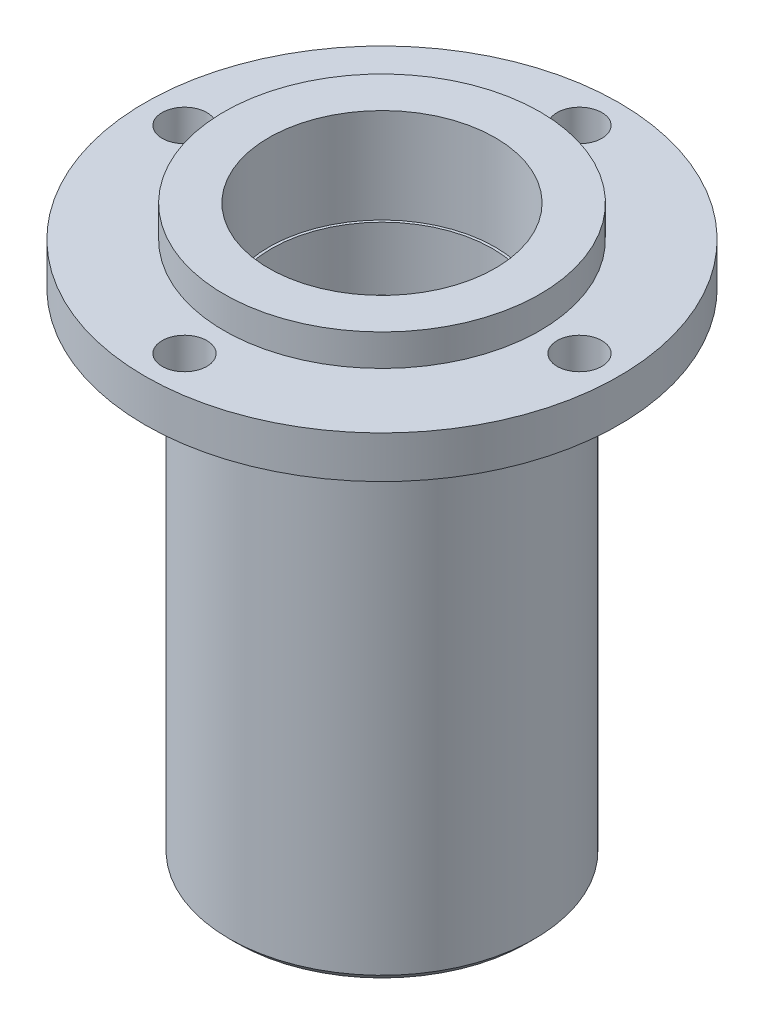
ISO-10303-21;
HEADER;
FILE_DESCRIPTION(('STEP AP214'),'2;1');
FILE_NAME('part.step','',(''),(''),'','','');
FILE_SCHEMA(('AUTOMOTIVE_DESIGN { 1 0 10303 214 1 1 1 1 }'));
ENDSEC;
DATA;
#1=APPLICATION_CONTEXT('core data for automotive mechanical design processes');
#2=APPLICATION_PROTOCOL_DEFINITION('international standard','automotive_design',2000,#1);
#3=PRODUCT_CONTEXT('',#1,'mechanical');
#4=PRODUCT('Part','Part','',(#3));
#5=PRODUCT_RELATED_PRODUCT_CATEGORY('part','',(#4));
#6=PRODUCT_DEFINITION_FORMATION('','',#4);
#7=PRODUCT_DEFINITION_CONTEXT('part definition',#1,'design');
#8=PRODUCT_DEFINITION('design','',#6,#7);
#9=PRODUCT_DEFINITION_SHAPE('','',#8);
#10=(LENGTH_UNIT() NAMED_UNIT(*) SI_UNIT(.MILLI.,.METRE.));
#11=(NAMED_UNIT(*) PLANE_ANGLE_UNIT() SI_UNIT($,.RADIAN.));
#12=(NAMED_UNIT(*) SI_UNIT($,.STERADIAN.) SOLID_ANGLE_UNIT());
#13=UNCERTAINTY_MEASURE_WITH_UNIT(LENGTH_MEASURE(1.E-05),#10,'distance_accuracy_value','');
#14=(GEOMETRIC_REPRESENTATION_CONTEXT(3) GLOBAL_UNCERTAINTY_ASSIGNED_CONTEXT((#13)) GLOBAL_UNIT_ASSIGNED_CONTEXT((#10,
#11,#12)) REPRESENTATION_CONTEXT('',''));
#15=CARTESIAN_POINT('',(0.,0.,0.));
#16=DIRECTION('',(0.,0.,1.));
#17=DIRECTION('',(1.,0.,0.));
#18=AXIS2_PLACEMENT_3D('',#15,#16,#17);
#19=CARTESIAN_POINT('',(0.,0.,0.));
#20=DIRECTION('',(0.,-1.,0.));
#21=DIRECTION('',(0.,0.,-1.));
#22=AXIS2_PLACEMENT_3D('',#19,#20,#21);
#23=CYLINDRICAL_SURFACE('',#22,29.);
#24=CARTESIAN_POINT('',(0.,1.50000000000001,0.));
#25=DIRECTION('',(0.,-1.,0.));
#26=DIRECTION('',(0.,0.,-1.));
#27=AXIS2_PLACEMENT_3D('',#24,#25,#26);
#28=CIRCLE('',#27,29.);
#29=CARTESIAN_POINT('',(0.,1.50000000000001,-29.));
#30=VERTEX_POINT('',#29);
#31=EDGE_CURVE('E10',#30,#30,#28,.F.);
#32=ORIENTED_EDGE('',*,*,#31,.T.);
#33=EDGE_LOOP('',(#32));
#34=FACE_BOUND('',#33,.T.);
#35=CARTESIAN_POINT('',(0.,94.,0.));
#36=DIRECTION('',(0.,-1.,0.));
#37=DIRECTION('',(0.,0.,-1.));
#38=AXIS2_PLACEMENT_3D('',#35,#36,#37);
#39=CIRCLE('',#38,29.);
#40=CARTESIAN_POINT('',(0.,94.,-29.));
#41=VERTEX_POINT('',#40);
#42=EDGE_CURVE('E42',#41,#41,#39,.T.);
#43=ORIENTED_EDGE('',*,*,#42,.T.);
#44=EDGE_LOOP('',(#43));
#45=FACE_BOUND('',#44,.T.);
#46=ADVANCED_FACE('F32',(#34,#45),#23,.T.);
#47=CARTESIAN_POINT('',(29.,94.,0.));
#48=DIRECTION('',(0.,-1.,0.));
#49=DIRECTION('',(0.,0.,-1.));
#50=AXIS2_PLACEMENT_3D('',#47,#48,#49);
#51=PLANE('',#50);
#52=CARTESIAN_POINT('',(37.5,94.,-3.89322431172852E-13));
#53=DIRECTION('',(0.,-1.,0.));
#54=DIRECTION('',(1.,0.,0.));
#55=AXIS2_PLACEMENT_3D('',#52,#53,#54);
#56=CIRCLE('',#55,4.25);
#57=CARTESIAN_POINT('',(41.75,94.,-4.33838844026996E-13));
#58=VERTEX_POINT('',#57);
#59=EDGE_CURVE('E106',#58,#58,#56,.F.);
#60=ORIENTED_EDGE('',*,*,#59,.T.);
#61=EDGE_LOOP('',(#60));
#62=FACE_BOUND('',#61,.T.);
#63=CARTESIAN_POINT('',(2.5839180513125E-13,94.,37.5));
#64=DIRECTION('',(0.,-1.,0.));
#65=DIRECTION('',(0.,0.,1.));
#66=AXIS2_PLACEMENT_3D('',#63,#64,#65);
#67=CIRCLE('',#66,4.25);
#68=CARTESIAN_POINT('',(2.8806941370068E-13,94.,41.75));
#69=VERTEX_POINT('',#68);
#70=EDGE_CURVE('E100',#69,#69,#67,.F.);
#71=ORIENTED_EDGE('',*,*,#70,.T.);
#72=EDGE_LOOP('',(#71));
#73=FACE_BOUND('',#72,.T.);
#74=CARTESIAN_POINT('',(-37.5,94.,1.27461179089648E-13));
#75=DIRECTION('',(0.,-1.,0.));
#76=DIRECTION('',(-1.,0.,0.));
#77=AXIS2_PLACEMENT_3D('',#74,#75,#76);
#78=CIRCLE('',#77,4.25);
#79=CARTESIAN_POINT('',(-41.75,94.,1.42299983374363E-13));
#80=VERTEX_POINT('',#79);
#81=EDGE_CURVE('E94',#80,#80,#78,.F.);
#82=ORIENTED_EDGE('',*,*,#81,.T.);
#83=EDGE_LOOP('',(#82));
#84=FACE_BOUND('',#83,.T.);
#85=CARTESIAN_POINT('',(0.,94.,-37.5));
#86=DIRECTION('',(0.,-1.,0.));
#87=DIRECTION('',(0.,0.,-1.));
#88=AXIS2_PLACEMENT_3D('',#85,#86,#87);
#89=CIRCLE('',#88,4.25);
#90=CARTESIAN_POINT('',(0.,94.,-41.75));
#91=VERTEX_POINT('',#90);
#92=EDGE_CURVE('E86',#91,#91,#89,.F.);
#93=ORIENTED_EDGE('',*,*,#92,.T.);
#94=EDGE_LOOP('',(#93));
#95=FACE_BOUND('',#94,.T.);
#96=CARTESIAN_POINT('',(0.,94.,0.));
#97=DIRECTION('',(0.,-1.,0.));
#98=DIRECTION('',(0.,0.,-1.));
#99=AXIS2_PLACEMENT_3D('',#96,#97,#98);
#100=CIRCLE('',#99,45.);
#101=CARTESIAN_POINT('',(0.,94.,-45.));
#102=VERTEX_POINT('',#101);
#103=EDGE_CURVE('E46',#102,#102,#100,.T.);
#104=ORIENTED_EDGE('',*,*,#103,.T.);
#105=EDGE_LOOP('',(#104));
#106=FACE_BOUND('',#105,.T.);
#107=ORIENTED_EDGE('',*,*,#42,.F.);
#108=EDGE_LOOP('',(#107));
#109=FACE_BOUND('',#108,.T.);
#110=ADVANCED_FACE('F110',(#62,#73,#84,#95,#106,#109),#51,.T.);
#111=CARTESIAN_POINT('',(0.,0.,0.));
#112=DIRECTION('',(0.,-1.,0.));
#113=DIRECTION('',(0.,0.,-1.));
#114=AXIS2_PLACEMENT_3D('',#111,#112,#113);
#115=CYLINDRICAL_SURFACE('',#114,45.);
#116=CARTESIAN_POINT('',(0.,102.,0.));
#117=DIRECTION('',(0.,-1.,0.));
#118=DIRECTION('',(0.,0.,-1.));
#119=AXIS2_PLACEMENT_3D('',#116,#117,#118);
#120=CIRCLE('',#119,45.);
#121=CARTESIAN_POINT('',(0.,102.,-45.));
#122=VERTEX_POINT('',#121);
#123=EDGE_CURVE('E52',#122,#122,#120,.T.);
#124=ORIENTED_EDGE('',*,*,#123,.T.);
#125=EDGE_LOOP('',(#124));
#126=FACE_BOUND('',#125,.T.);
#127=ORIENTED_EDGE('',*,*,#103,.F.);
#128=EDGE_LOOP('',(#127));
#129=FACE_BOUND('',#128,.T.);
#130=ADVANCED_FACE('F125',(#126,#129),#115,.T.);
#131=CARTESIAN_POINT('',(45.,102.,0.));
#132=DIRECTION('',(0.,1.,0.));
#133=DIRECTION('',(0.,0.,1.));
#134=AXIS2_PLACEMENT_3D('',#131,#132,#133);
#135=PLANE('',#134);
#136=CARTESIAN_POINT('',(37.5,102.,-3.89322431172852E-13));
#137=DIRECTION('',(0.,1.,0.));
#138=DIRECTION('',(-1.,0.,0.));
#139=AXIS2_PLACEMENT_3D('',#136,#137,#138);
#140=CIRCLE('',#139,4.25);
#141=CARTESIAN_POINT('',(33.25,102.,-3.44806018318707E-13));
#142=VERTEX_POINT('',#141);
#143=EDGE_CURVE('E103',#142,#142,#140,.T.);
#144=ORIENTED_EDGE('',*,*,#143,.F.);
#145=EDGE_LOOP('',(#144));
#146=FACE_BOUND('',#145,.T.);
#147=CARTESIAN_POINT('',(2.5839180513125E-13,102.,37.5));
#148=DIRECTION('',(0.,1.,0.));
#149=DIRECTION('',(0.,0.,-1.));
#150=AXIS2_PLACEMENT_3D('',#147,#148,#149);
#151=CIRCLE('',#150,4.25);
#152=CARTESIAN_POINT('',(2.2871419656182E-13,102.,33.25));
#153=VERTEX_POINT('',#152);
#154=EDGE_CURVE('E97',#153,#153,#151,.T.);
#155=ORIENTED_EDGE('',*,*,#154,.F.);
#156=EDGE_LOOP('',(#155));
#157=FACE_BOUND('',#156,.T.);
#158=CARTESIAN_POINT('',(-37.5,102.,1.27461179089648E-13));
#159=DIRECTION('',(0.,1.,0.));
#160=DIRECTION('',(1.,0.,0.));
#161=AXIS2_PLACEMENT_3D('',#158,#159,#160);
#162=CIRCLE('',#161,4.25);
#163=CARTESIAN_POINT('',(-33.25,102.,1.12622374804933E-13));
#164=VERTEX_POINT('',#163);
#165=EDGE_CURVE('E89',#164,#164,#162,.T.);
#166=ORIENTED_EDGE('',*,*,#165,.F.);
#167=EDGE_LOOP('',(#166));
#168=FACE_BOUND('',#167,.T.);
#169=CARTESIAN_POINT('',(0.,102.,-37.5));
#170=DIRECTION('',(0.,1.,0.));
#171=DIRECTION('',(0.,0.,1.));
#172=AXIS2_PLACEMENT_3D('',#169,#170,#171);
#173=CIRCLE('',#172,4.25);
#174=CARTESIAN_POINT('',(0.,102.,-33.25));
#175=VERTEX_POINT('',#174);
#176=EDGE_CURVE('E85',#175,#175,#173,.T.);
#177=ORIENTED_EDGE('',*,*,#176,.F.);
#178=EDGE_LOOP('',(#177));
#179=FACE_BOUND('',#178,.T.);
#180=CARTESIAN_POINT('',(0.,102.,0.));
#181=DIRECTION('',(0.,-1.,0.));
#182=DIRECTION('',(0.,0.,-1.));
#183=AXIS2_PLACEMENT_3D('',#180,#181,#182);
#184=CIRCLE('',#183,30.);
#185=CARTESIAN_POINT('',(0.,102.,-30.));
#186=VERTEX_POINT('',#185);
#187=EDGE_CURVE('E55',#186,#186,#184,.T.);
#188=ORIENTED_EDGE('',*,*,#187,.T.);
#189=EDGE_LOOP('',(#188));
#190=FACE_BOUND('',#189,.T.);
#191=ORIENTED_EDGE('',*,*,#123,.F.);
#192=EDGE_LOOP('',(#191));
#193=FACE_BOUND('',#192,.T.);
#194=ADVANCED_FACE('F121',(#146,#157,#168,#179,#190,#193),#135,.T.);
#195=CARTESIAN_POINT('',(0.,0.,0.));
#196=DIRECTION('',(0.,-1.,0.));
#197=DIRECTION('',(0.,0.,-1.));
#198=AXIS2_PLACEMENT_3D('',#195,#196,#197);
#199=CYLINDRICAL_SURFACE('',#198,30.);
#200=CARTESIAN_POINT('',(0.,108.,0.));
#201=DIRECTION('',(0.,-1.,0.));
#202=DIRECTION('',(0.,0.,-1.));
#203=AXIS2_PLACEMENT_3D('',#200,#201,#202);
#204=CIRCLE('',#203,30.);
#205=CARTESIAN_POINT('',(0.,108.,-30.));
#206=VERTEX_POINT('',#205);
#207=EDGE_CURVE('E58',#206,#206,#204,.T.);
#208=ORIENTED_EDGE('',*,*,#207,.T.);
#209=EDGE_LOOP('',(#208));
#210=FACE_BOUND('',#209,.T.);
#211=ORIENTED_EDGE('',*,*,#187,.F.);
#212=EDGE_LOOP('',(#211));
#213=FACE_BOUND('',#212,.T.);
#214=ADVANCED_FACE('F124',(#210,#213),#199,.T.);
#215=CARTESIAN_POINT('',(30.,108.,0.));
#216=DIRECTION('',(0.,1.,0.));
#217=DIRECTION('',(0.,0.,1.));
#218=AXIS2_PLACEMENT_3D('',#215,#216,#217);
#219=PLANE('',#218);
#220=CARTESIAN_POINT('',(0.,108.,0.));
#221=DIRECTION('',(0.,-1.,0.));
#222=DIRECTION('',(0.,0.,-1.));
#223=AXIS2_PLACEMENT_3D('',#220,#221,#222);
#224=CIRCLE('',#223,21.5);
#225=CARTESIAN_POINT('',(0.,108.,-21.5));
#226=VERTEX_POINT('',#225);
#227=EDGE_CURVE('E61',#226,#226,#224,.T.);
#228=ORIENTED_EDGE('',*,*,#227,.T.);
#229=EDGE_LOOP('',(#228));
#230=FACE_BOUND('',#229,.T.);
#231=ORIENTED_EDGE('',*,*,#207,.F.);
#232=EDGE_LOOP('',(#231));
#233=FACE_BOUND('',#232,.T.);
#234=ADVANCED_FACE('F172',(#230,#233),#219,.T.);
#235=CARTESIAN_POINT('',(0.,0.,0.));
#236=DIRECTION('',(0.,-1.,0.));
#237=DIRECTION('',(0.,0.,-1.));
#238=AXIS2_PLACEMENT_3D('',#235,#236,#237);
#239=CYLINDRICAL_SURFACE('',#238,21.5);
#240=CARTESIAN_POINT('',(0.,90.,0.));
#241=DIRECTION('',(0.,-1.,0.));
#242=DIRECTION('',(0.,0.,-1.));
#243=AXIS2_PLACEMENT_3D('',#240,#241,#242);
#244=CIRCLE('',#243,21.5);
#245=CARTESIAN_POINT('',(0.,90.,-21.5));
#246=VERTEX_POINT('',#245);
#247=EDGE_CURVE('E64',#246,#246,#244,.T.);
#248=ORIENTED_EDGE('',*,*,#247,.T.);
#249=EDGE_LOOP('',(#248));
#250=FACE_BOUND('',#249,.T.);
#251=ORIENTED_EDGE('',*,*,#227,.F.);
#252=EDGE_LOOP('',(#251));
#253=FACE_BOUND('',#252,.T.);
#254=ADVANCED_FACE('F179',(#250,#253),#239,.F.);
#255=CARTESIAN_POINT('',(21.5,90.,0.));
#256=DIRECTION('',(0.,1.,0.));
#257=DIRECTION('',(0.,0.,1.));
#258=AXIS2_PLACEMENT_3D('',#255,#256,#257);
#259=PLANE('',#258);
#260=CARTESIAN_POINT('',(0.,90.,0.));
#261=DIRECTION('',(0.,-1.,0.));
#262=DIRECTION('',(0.,0.,-1.));
#263=AXIS2_PLACEMENT_3D('',#260,#261,#262);
#264=CIRCLE('',#263,21.);
#265=CARTESIAN_POINT('',(0.,90.,-21.));
#266=VERTEX_POINT('',#265);
#267=EDGE_CURVE('E67',#266,#266,#264,.T.);
#268=ORIENTED_EDGE('',*,*,#267,.T.);
#269=EDGE_LOOP('',(#268));
#270=FACE_BOUND('',#269,.T.);
#271=ORIENTED_EDGE('',*,*,#247,.F.);
#272=EDGE_LOOP('',(#271));
#273=FACE_BOUND('',#272,.T.);
#274=ADVANCED_FACE('F187',(#270,#273),#259,.T.);
#275=CARTESIAN_POINT('',(0.,0.,0.));
#276=DIRECTION('',(0.,-1.,0.));
#277=DIRECTION('',(0.,0.,-1.));
#278=AXIS2_PLACEMENT_3D('',#275,#276,#277);
#279=CYLINDRICAL_SURFACE('',#278,21.);
#280=CARTESIAN_POINT('',(0.,78.,0.));
#281=DIRECTION('',(0.,-1.,0.));
#282=DIRECTION('',(0.,0.,-1.));
#283=AXIS2_PLACEMENT_3D('',#280,#281,#282);
#284=CIRCLE('',#283,21.);
#285=CARTESIAN_POINT('',(0.,78.,-21.));
#286=VERTEX_POINT('',#285);
#287=EDGE_CURVE('E70',#286,#286,#284,.T.);
#288=ORIENTED_EDGE('',*,*,#287,.T.);
#289=EDGE_LOOP('',(#288));
#290=FACE_BOUND('',#289,.T.);
#291=ORIENTED_EDGE('',*,*,#267,.F.);
#292=EDGE_LOOP('',(#291));
#293=FACE_BOUND('',#292,.T.);
#294=ADVANCED_FACE('F195',(#290,#293),#279,.F.);
#295=CARTESIAN_POINT('',(21.,78.,0.));
#296=DIRECTION('',(0.,1.,0.));
#297=DIRECTION('',(0.,0.,1.));
#298=AXIS2_PLACEMENT_3D('',#295,#296,#297);
#299=PLANE('',#298);
#300=CARTESIAN_POINT('',(0.,78.,0.));
#301=DIRECTION('',(0.,-1.,0.));
#302=DIRECTION('',(0.,0.,-1.));
#303=AXIS2_PLACEMENT_3D('',#300,#301,#302);
#304=CIRCLE('',#303,19.);
#305=CARTESIAN_POINT('',(0.,78.,-19.));
#306=VERTEX_POINT('',#305);
#307=EDGE_CURVE('E73',#306,#306,#304,.T.);
#308=ORIENTED_EDGE('',*,*,#307,.T.);
#309=EDGE_LOOP('',(#308));
#310=FACE_BOUND('',#309,.T.);
#311=ORIENTED_EDGE('',*,*,#287,.F.);
#312=EDGE_LOOP('',(#311));
#313=FACE_BOUND('',#312,.T.);
#314=ADVANCED_FACE('F203',(#310,#313),#299,.T.);
#315=CARTESIAN_POINT('',(0.,0.,0.));
#316=DIRECTION('',(0.,-1.,0.));
#317=DIRECTION('',(0.,0.,-1.));
#318=AXIS2_PLACEMENT_3D('',#315,#316,#317);
#319=CYLINDRICAL_SURFACE('',#318,19.);
#320=CARTESIAN_POINT('',(0.,12.,0.));
#321=DIRECTION('',(0.,-1.,0.));
#322=DIRECTION('',(0.,0.,-1.));
#323=AXIS2_PLACEMENT_3D('',#320,#321,#322);
#324=CIRCLE('',#323,19.);
#325=CARTESIAN_POINT('',(0.,12.,-19.));
#326=VERTEX_POINT('',#325);
#327=EDGE_CURVE('E76',#326,#326,#324,.T.);
#328=ORIENTED_EDGE('',*,*,#327,.T.);
#329=EDGE_LOOP('',(#328));
#330=FACE_BOUND('',#329,.T.);
#331=ORIENTED_EDGE('',*,*,#307,.F.);
#332=EDGE_LOOP('',(#331));
#333=FACE_BOUND('',#332,.T.);
#334=ADVANCED_FACE('F211',(#330,#333),#319,.F.);
#335=CARTESIAN_POINT('',(19.,12.,0.));
#336=DIRECTION('',(0.,-1.,0.));
#337=DIRECTION('',(0.,0.,-1.));
#338=AXIS2_PLACEMENT_3D('',#335,#336,#337);
#339=PLANE('',#338);
#340=CARTESIAN_POINT('',(0.,12.,0.));
#341=DIRECTION('',(0.,-1.,0.));
#342=DIRECTION('',(0.,0.,-1.));
#343=AXIS2_PLACEMENT_3D('',#340,#341,#342);
#344=CIRCLE('',#343,21.);
#345=CARTESIAN_POINT('',(0.,12.,-21.));
#346=VERTEX_POINT('',#345);
#347=EDGE_CURVE('E79',#346,#346,#344,.T.);
#348=ORIENTED_EDGE('',*,*,#347,.T.);
#349=EDGE_LOOP('',(#348));
#350=FACE_BOUND('',#349,.T.);
#351=ORIENTED_EDGE('',*,*,#327,.F.);
#352=EDGE_LOOP('',(#351));
#353=FACE_BOUND('',#352,.T.);
#354=ADVANCED_FACE('F220',(#350,#353),#339,.T.);
#355=CARTESIAN_POINT('',(0.,0.,0.));
#356=DIRECTION('',(0.,-1.,0.));
#357=DIRECTION('',(0.,0.,-1.));
#358=AXIS2_PLACEMENT_3D('',#355,#356,#357);
#359=CYLINDRICAL_SURFACE('',#358,21.);
#360=CARTESIAN_POINT('',(0.,0.,0.));
#361=DIRECTION('',(0.,-1.,0.));
#362=DIRECTION('',(0.,0.,-1.));
#363=AXIS2_PLACEMENT_3D('',#360,#361,#362);
#364=CIRCLE('',#363,21.);
#365=CARTESIAN_POINT('',(0.,0.,-21.));
#366=VERTEX_POINT('',#365);
#367=EDGE_CURVE('E82',#366,#366,#364,.T.);
#368=ORIENTED_EDGE('',*,*,#367,.T.);
#369=EDGE_LOOP('',(#368));
#370=FACE_BOUND('',#369,.T.);
#371=ORIENTED_EDGE('',*,*,#347,.F.);
#372=EDGE_LOOP('',(#371));
#373=FACE_BOUND('',#372,.T.);
#374=ADVANCED_FACE('F228',(#370,#373),#359,.F.);
#375=CARTESIAN_POINT('',(21.,0.,0.));
#376=DIRECTION('',(0.,-1.,0.));
#377=DIRECTION('',(0.,0.,-1.));
#378=AXIS2_PLACEMENT_3D('',#375,#376,#377);
#379=PLANE('',#378);
#380=CARTESIAN_POINT('',(0.,0.,0.));
#381=DIRECTION('',(0.,-1.,0.));
#382=DIRECTION('',(0.,0.,-1.));
#383=AXIS2_PLACEMENT_3D('',#380,#381,#382);
#384=CIRCLE('',#383,27.5);
#385=CARTESIAN_POINT('',(0.,0.,-27.5));
#386=VERTEX_POINT('',#385);
#387=EDGE_CURVE('E38',#386,#386,#384,.T.);
#388=ORIENTED_EDGE('',*,*,#387,.T.);
#389=EDGE_LOOP('',(#388));
#390=FACE_BOUND('',#389,.T.);
#391=ORIENTED_EDGE('',*,*,#367,.F.);
#392=EDGE_LOOP('',(#391));
#393=FACE_BOUND('',#392,.T.);
#394=ADVANCED_FACE('F236',(#390,#393),#379,.T.);
#395=CARTESIAN_POINT('',(0.,-0.001000000000001,-37.5));
#396=DIRECTION('',(0.,1.,0.));
#397=DIRECTION('',(0.,0.,1.));
#398=AXIS2_PLACEMENT_3D('',#395,#396,#397);
#399=CYLINDRICAL_SURFACE('',#398,4.25);
#400=ORIENTED_EDGE('',*,*,#92,.F.);
#401=EDGE_LOOP('',(#400));
#402=FACE_BOUND('',#401,.T.);
#403=ORIENTED_EDGE('',*,*,#176,.T.);
#404=EDGE_LOOP('',(#403));
#405=FACE_BOUND('',#404,.T.);
#406=ADVANCED_FACE('F243',(#402,#405),#399,.F.);
#407=CARTESIAN_POINT('',(-37.5,-0.001000000000001,1.27461179089648E-13));
#408=DIRECTION('',(0.,1.,0.));
#409=DIRECTION('',(1.,0.,0.));
#410=AXIS2_PLACEMENT_3D('',#407,#408,#409);
#411=CYLINDRICAL_SURFACE('',#410,4.25);
#412=ORIENTED_EDGE('',*,*,#81,.F.);
#413=EDGE_LOOP('',(#412));
#414=FACE_BOUND('',#413,.T.);
#415=ORIENTED_EDGE('',*,*,#165,.T.);
#416=EDGE_LOOP('',(#415));
#417=FACE_BOUND('',#416,.T.);
#418=ADVANCED_FACE('F248',(#414,#417),#411,.F.);
#419=CARTESIAN_POINT('',(2.5839180513125E-13,-0.001000000000001,37.5));
#420=DIRECTION('',(0.,1.,0.));
#421=DIRECTION('',(0.,0.,-1.));
#422=AXIS2_PLACEMENT_3D('',#419,#420,#421);
#423=CYLINDRICAL_SURFACE('',#422,4.25);
#424=ORIENTED_EDGE('',*,*,#70,.F.);
#425=EDGE_LOOP('',(#424));
#426=FACE_BOUND('',#425,.T.);
#427=ORIENTED_EDGE('',*,*,#154,.T.);
#428=EDGE_LOOP('',(#427));
#429=FACE_BOUND('',#428,.T.);
#430=ADVANCED_FACE('F117',(#426,#429),#423,.F.);
#431=CARTESIAN_POINT('',(37.5,-0.001000000000001,-3.89322431172852E-13));
#432=DIRECTION('',(0.,1.,0.));
#433=DIRECTION('',(-1.,0.,0.));
#434=AXIS2_PLACEMENT_3D('',#431,#432,#433);
#435=CYLINDRICAL_SURFACE('',#434,4.25);
#436=ORIENTED_EDGE('',*,*,#59,.F.);
#437=EDGE_LOOP('',(#436));
#438=FACE_BOUND('',#437,.T.);
#439=ORIENTED_EDGE('',*,*,#143,.T.);
#440=EDGE_LOOP('',(#439));
#441=FACE_BOUND('',#440,.T.);
#442=ADVANCED_FACE('F113',(#438,#441),#435,.F.);
#443=CARTESIAN_POINT('',(0.,0.,0.));
#444=DIRECTION('',(0.,1.,0.));
#445=DIRECTION('',(0.,0.,1.));
#446=AXIS2_PLACEMENT_3D('',#443,#444,#445);
#447=CONICAL_SURFACE('',#446,27.5,0.785398163397453);
#448=ORIENTED_EDGE('',*,*,#31,.F.);
#449=EDGE_LOOP('',(#448));
#450=FACE_BOUND('',#449,.T.);
#451=ORIENTED_EDGE('',*,*,#387,.F.);
#452=EDGE_LOOP('',(#451));
#453=FACE_BOUND('',#452,.T.);
#454=ADVANCED_FACE('F116',(#450,#453),#447,.T.);
#455=CLOSED_SHELL('',(#46,#110,#130,#194,#214,#234,#254,#274,#294,#314,#334,#354,#374,#394,#406,
#418,#430,#442,#454));
#456=MANIFOLD_SOLID_BREP('B2',#455);
#457=ADVANCED_BREP_SHAPE_REPRESENTATION('',(#18,#456),#14);
#458=SHAPE_DEFINITION_REPRESENTATION(#9,#457);
ENDSEC;
END-ISO-10303-21;
